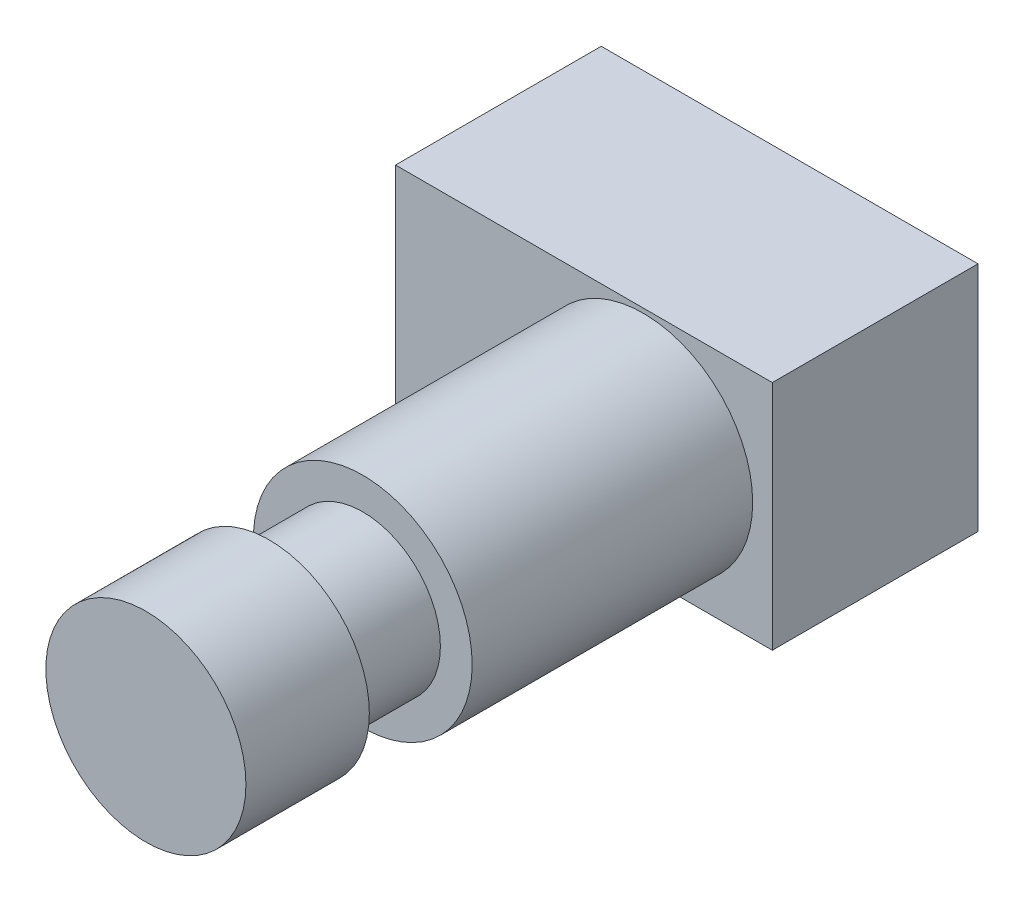
ISO-10303-21;
HEADER;
FILE_DESCRIPTION(('STEP AP214'),'2;1');
FILE_NAME('part.step','',(''),(''),'','','');
FILE_SCHEMA(('AUTOMOTIVE_DESIGN { 1 0 10303 214 1 1 1 1 }'));
ENDSEC;
DATA;
#1=APPLICATION_CONTEXT('core data for automotive mechanical design processes');
#2=APPLICATION_PROTOCOL_DEFINITION('international standard','automotive_design',2000,#1);
#3=PRODUCT_CONTEXT('',#1,'mechanical');
#4=PRODUCT('Part','Part','',(#3));
#5=PRODUCT_RELATED_PRODUCT_CATEGORY('part','',(#4));
#6=PRODUCT_DEFINITION_FORMATION('','',#4);
#7=PRODUCT_DEFINITION_CONTEXT('part definition',#1,'design');
#8=PRODUCT_DEFINITION('design','',#6,#7);
#9=PRODUCT_DEFINITION_SHAPE('','',#8);
#10=(LENGTH_UNIT() NAMED_UNIT(*) SI_UNIT(.MILLI.,.METRE.));
#11=(NAMED_UNIT(*) PLANE_ANGLE_UNIT() SI_UNIT($,.RADIAN.));
#12=(NAMED_UNIT(*) SI_UNIT($,.STERADIAN.) SOLID_ANGLE_UNIT());
#13=UNCERTAINTY_MEASURE_WITH_UNIT(LENGTH_MEASURE(1.E-05),#10,'distance_accuracy_value','');
#14=(GEOMETRIC_REPRESENTATION_CONTEXT(3) GLOBAL_UNCERTAINTY_ASSIGNED_CONTEXT((#13)) GLOBAL_UNIT_ASSIGNED_CONTEXT((#10,
#11,#12)) REPRESENTATION_CONTEXT('',''));
#15=CARTESIAN_POINT('',(0.,0.,0.));
#16=DIRECTION('',(0.,0.,1.));
#17=DIRECTION('',(1.,0.,0.));
#18=AXIS2_PLACEMENT_3D('',#15,#16,#17);
#19=CARTESIAN_POINT('',(0.,0.,15.));
#20=DIRECTION('',(0.,0.,-1.));
#21=DIRECTION('',(-1.,0.,0.));
#22=AXIS2_PLACEMENT_3D('',#19,#20,#21);
#23=CYLINDRICAL_SURFACE('',#22,5.85);
#24=CARTESIAN_POINT('',(0.,0.,15.));
#25=DIRECTION('',(0.,0.,1.));
#26=DIRECTION('',(1.,0.,0.));
#27=AXIS2_PLACEMENT_3D('',#24,#25,#26);
#28=CIRCLE('',#27,5.85);
#29=CARTESIAN_POINT('',(5.85,0.,15.));
#30=VERTEX_POINT('',#29);
#31=EDGE_CURVE('E49',#30,#30,#28,.T.);
#32=ORIENTED_EDGE('',*,*,#31,.F.);
#33=EDGE_LOOP('',(#32));
#34=FACE_BOUND('',#33,.T.);
#35=CARTESIAN_POINT('',(0.,0.,0.));
#36=DIRECTION('',(0.,0.,1.));
#37=DIRECTION('',(1.,0.,0.));
#38=AXIS2_PLACEMENT_3D('',#35,#36,#37);
#39=CIRCLE('',#38,5.85);
#40=CARTESIAN_POINT('',(5.85,0.,0.));
#41=VERTEX_POINT('',#40);
#42=EDGE_CURVE('E42',#41,#41,#39,.T.);
#43=ORIENTED_EDGE('',*,*,#42,.T.);
#44=EDGE_LOOP('',(#43));
#45=FACE_BOUND('',#44,.T.);
#46=ADVANCED_FACE('F39',(#34,#45),#23,.T.);
#47=CARTESIAN_POINT('',(0.,0.,15.));
#48=DIRECTION('',(0.,0.,1.));
#49=DIRECTION('',(1.,0.,0.));
#50=AXIS2_PLACEMENT_3D('',#47,#48,#49);
#51=PLANE('',#50);
#52=CARTESIAN_POINT('',(0.,0.,15.));
#53=DIRECTION('',(0.,0.,1.));
#54=DIRECTION('',(1.,0.,0.));
#55=AXIS2_PLACEMENT_3D('',#52,#53,#54);
#56=CIRCLE('',#55,4.15);
#57=CARTESIAN_POINT('',(4.15,0.,15.));
#58=VERTEX_POINT('',#57);
#59=EDGE_CURVE('E11',#58,#58,#56,.T.);
#60=ORIENTED_EDGE('',*,*,#59,.F.);
#61=EDGE_LOOP('',(#60));
#62=FACE_BOUND('',#61,.T.);
#63=ORIENTED_EDGE('',*,*,#31,.T.);
#64=EDGE_LOOP('',(#63));
#65=FACE_BOUND('',#64,.T.);
#66=ADVANCED_FACE('F144',(#62,#65),#51,.T.);
#67=CARTESIAN_POINT('',(0.,0.,20.));
#68=DIRECTION('',(0.,0.,-1.));
#69=DIRECTION('',(-1.,0.,0.));
#70=AXIS2_PLACEMENT_3D('',#67,#68,#69);
#71=CYLINDRICAL_SURFACE('',#70,4.15);
#72=CARTESIAN_POINT('',(0.,0.,20.));
#73=DIRECTION('',(0.,0.,1.));
#74=DIRECTION('',(1.,0.,0.));
#75=AXIS2_PLACEMENT_3D('',#72,#73,#74);
#76=CIRCLE('',#75,4.15);
#77=CARTESIAN_POINT('',(4.15,0.,20.));
#78=VERTEX_POINT('',#77);
#79=EDGE_CURVE('E133',#78,#78,#76,.T.);
#80=ORIENTED_EDGE('',*,*,#79,.F.);
#81=EDGE_LOOP('',(#80));
#82=FACE_BOUND('',#81,.T.);
#83=ORIENTED_EDGE('',*,*,#59,.T.);
#84=EDGE_LOOP('',(#83));
#85=FACE_BOUND('',#84,.T.);
#86=ADVANCED_FACE('F184',(#82,#85),#71,.T.);
#87=CARTESIAN_POINT('',(0.,0.,26.6));
#88=DIRECTION('',(0.,0.,-1.));
#89=DIRECTION('',(-1.,0.,0.));
#90=AXIS2_PLACEMENT_3D('',#87,#88,#89);
#91=CYLINDRICAL_SURFACE('',#90,5.35);
#92=CARTESIAN_POINT('',(0.,0.,26.6));
#93=DIRECTION('',(0.,0.,1.));
#94=DIRECTION('',(1.,0.,0.));
#95=AXIS2_PLACEMENT_3D('',#92,#93,#94);
#96=CIRCLE('',#95,5.35);
#97=CARTESIAN_POINT('',(5.35,0.,26.6));
#98=VERTEX_POINT('',#97);
#99=EDGE_CURVE('E129',#98,#98,#96,.T.);
#100=ORIENTED_EDGE('',*,*,#99,.F.);
#101=EDGE_LOOP('',(#100));
#102=FACE_BOUND('',#101,.T.);
#103=CARTESIAN_POINT('',(0.,0.,20.));
#104=DIRECTION('',(0.,0.,1.));
#105=DIRECTION('',(1.,0.,0.));
#106=AXIS2_PLACEMENT_3D('',#103,#104,#105);
#107=CIRCLE('',#106,5.35);
#108=CARTESIAN_POINT('',(5.35,0.,20.));
#109=VERTEX_POINT('',#108);
#110=EDGE_CURVE('E134',#109,#109,#107,.T.);
#111=ORIENTED_EDGE('',*,*,#110,.T.);
#112=EDGE_LOOP('',(#111));
#113=FACE_BOUND('',#112,.T.);
#114=ADVANCED_FACE('F177',(#102,#113),#91,.T.);
#115=CARTESIAN_POINT('',(0.,0.,26.6));
#116=DIRECTION('',(0.,0.,1.));
#117=DIRECTION('',(1.,0.,0.));
#118=AXIS2_PLACEMENT_3D('',#115,#116,#117);
#119=PLANE('',#118);
#120=ORIENTED_EDGE('',*,*,#99,.T.);
#121=EDGE_LOOP('',(#120));
#122=FACE_BOUND('',#121,.T.);
#123=ADVANCED_FACE('F174',(#122),#119,.T.);
#124=CARTESIAN_POINT('',(0.,0.,20.));
#125=DIRECTION('',(0.,0.,1.));
#126=DIRECTION('',(1.,0.,0.));
#127=AXIS2_PLACEMENT_3D('',#124,#125,#126);
#128=PLANE('',#127);
#129=ORIENTED_EDGE('',*,*,#79,.T.);
#130=EDGE_LOOP('',(#129));
#131=FACE_BOUND('',#130,.T.);
#132=ORIENTED_EDGE('',*,*,#110,.F.);
#133=EDGE_LOOP('',(#132));
#134=FACE_BOUND('',#133,.T.);
#135=ADVANCED_FACE('F173',(#131,#134),#128,.F.);
#136=CARTESIAN_POINT('',(6.9,-6.31313605271234,-11.));
#137=DIRECTION('',(-1.,0.,0.));
#138=DIRECTION('',(0.,0.,1.));
#139=AXIS2_PLACEMENT_3D('',#136,#137,#138);
#140=PLANE('',#139);
#141=DIRECTION('',(0.,-1.,0.));
#142=VECTOR('',#141,1.);
#143=CARTESIAN_POINT('',(6.9,-6.31313605271234,0.));
#144=LINE('',#143,#142);
#145=CARTESIAN_POINT('',(6.9,6.08686394728766,0.));
#146=VERTEX_POINT('',#145);
#147=CARTESIAN_POINT('',(6.9,-6.31313605271234,0.));
#148=VERTEX_POINT('',#147);
#149=EDGE_CURVE('E113',#146,#148,#144,.T.);
#150=ORIENTED_EDGE('',*,*,#149,.T.);
#151=DIRECTION('',(0.,0.,1.));
#152=VECTOR('',#151,1.);
#153=CARTESIAN_POINT('',(6.9,-6.31313605271234,-11.));
#154=LINE('',#153,#152);
#155=CARTESIAN_POINT('',(6.9,-6.31313605271234,-11.));
#156=VERTEX_POINT('',#155);
#157=EDGE_CURVE('E102',#156,#148,#154,.T.);
#158=ORIENTED_EDGE('',*,*,#157,.F.);
#159=DIRECTION('',(0.,-1.,0.));
#160=VECTOR('',#159,1.);
#161=CARTESIAN_POINT('',(6.9,-6.31313605271234,-11.));
#162=LINE('',#161,#160);
#163=CARTESIAN_POINT('',(6.9,6.08686394728766,-11.));
#164=VERTEX_POINT('',#163);
#165=EDGE_CURVE('E94',#164,#156,#162,.T.);
#166=ORIENTED_EDGE('',*,*,#165,.F.);
#167=DIRECTION('',(0.,0.,1.));
#168=VECTOR('',#167,1.);
#169=CARTESIAN_POINT('',(6.9,6.08686394728766,-11.));
#170=LINE('',#169,#168);
#171=EDGE_CURVE('E109',#164,#146,#170,.T.);
#172=ORIENTED_EDGE('',*,*,#171,.T.);
#173=EDGE_LOOP('',(#150,#158,#166,#172));
#174=FACE_BOUND('',#173,.T.);
#175=ADVANCED_FACE('F158',(#174),#140,.F.);
#176=CARTESIAN_POINT('',(-13.25,-6.31313605271234,-11.));
#177=DIRECTION('',(0.,1.,0.));
#178=DIRECTION('',(-1.,0.,0.));
#179=AXIS2_PLACEMENT_3D('',#176,#177,#178);
#180=PLANE('',#179);
#181=DIRECTION('',(-1.,0.,0.));
#182=VECTOR('',#181,1.);
#183=CARTESIAN_POINT('',(-13.25,-6.31313605271234,0.));
#184=LINE('',#183,#182);
#185=CARTESIAN_POINT('',(-13.25,-6.31313605271234,0.));
#186=VERTEX_POINT('',#185);
#187=EDGE_CURVE('E100',#148,#186,#184,.T.);
#188=ORIENTED_EDGE('',*,*,#187,.T.);
#189=DIRECTION('',(0.,0.,1.));
#190=VECTOR('',#189,1.);
#191=CARTESIAN_POINT('',(-13.25,-6.31313605271234,-11.));
#192=LINE('',#191,#190);
#193=CARTESIAN_POINT('',(-13.25,-6.31313605271234,-11.));
#194=VERTEX_POINT('',#193);
#195=EDGE_CURVE('E98',#194,#186,#192,.T.);
#196=ORIENTED_EDGE('',*,*,#195,.F.);
#197=DIRECTION('',(-1.,0.,0.));
#198=VECTOR('',#197,1.);
#199=CARTESIAN_POINT('',(-13.25,-6.31313605271234,-11.));
#200=LINE('',#199,#198);
#201=EDGE_CURVE('E89',#156,#194,#200,.T.);
#202=ORIENTED_EDGE('',*,*,#201,.F.);
#203=ORIENTED_EDGE('',*,*,#157,.T.);
#204=EDGE_LOOP('',(#188,#196,#202,#203));
#205=FACE_BOUND('',#204,.T.);
#206=ADVANCED_FACE('F99',(#205),#180,.F.);
#207=CARTESIAN_POINT('',(-13.25,-6.31313605271234,-11.));
#208=DIRECTION('',(1.,0.,0.));
#209=DIRECTION('',(0.,0.,-1.));
#210=AXIS2_PLACEMENT_3D('',#207,#208,#209);
#211=PLANE('',#210);
#212=DIRECTION('',(0.,1.,0.));
#213=VECTOR('',#212,1.);
#214=CARTESIAN_POINT('',(-13.25,-6.31313605271234,0.));
#215=LINE('',#214,#213);
#216=CARTESIAN_POINT('',(-13.25,6.08686394728766,0.));
#217=VERTEX_POINT('',#216);
#218=EDGE_CURVE('E75',#186,#217,#215,.T.);
#219=ORIENTED_EDGE('',*,*,#218,.T.);
#220=DIRECTION('',(0.,0.,1.));
#221=VECTOR('',#220,1.);
#222=CARTESIAN_POINT('',(-13.25,6.08686394728766,-11.));
#223=LINE('',#222,#221);
#224=CARTESIAN_POINT('',(-13.25,6.08686394728766,-11.));
#225=VERTEX_POINT('',#224);
#226=EDGE_CURVE('E103',#225,#217,#223,.T.);
#227=ORIENTED_EDGE('',*,*,#226,.F.);
#228=DIRECTION('',(0.,1.,0.));
#229=VECTOR('',#228,1.);
#230=CARTESIAN_POINT('',(-13.25,-6.31313605271234,-11.));
#231=LINE('',#230,#229);
#232=EDGE_CURVE('E92',#194,#225,#231,.T.);
#233=ORIENTED_EDGE('',*,*,#232,.F.);
#234=ORIENTED_EDGE('',*,*,#195,.T.);
#235=EDGE_LOOP('',(#219,#227,#233,#234));
#236=FACE_BOUND('',#235,.T.);
#237=ADVANCED_FACE('F105',(#236),#211,.F.);
#238=CARTESIAN_POINT('',(-13.25,6.08686394728766,-11.));
#239=DIRECTION('',(0.,-1.,0.));
#240=DIRECTION('',(1.,0.,0.));
#241=AXIS2_PLACEMENT_3D('',#238,#239,#240);
#242=PLANE('',#241);
#243=DIRECTION('',(1.,0.,0.));
#244=VECTOR('',#243,1.);
#245=CARTESIAN_POINT('',(-13.25,6.08686394728766,0.));
#246=LINE('',#245,#244);
#247=EDGE_CURVE('E81',#217,#146,#246,.T.);
#248=ORIENTED_EDGE('',*,*,#247,.T.);
#249=ORIENTED_EDGE('',*,*,#171,.F.);
#250=DIRECTION('',(1.,0.,0.));
#251=VECTOR('',#250,1.);
#252=CARTESIAN_POINT('',(-13.25,6.08686394728766,-11.));
#253=LINE('',#252,#251);
#254=EDGE_CURVE('E58',#225,#164,#253,.T.);
#255=ORIENTED_EDGE('',*,*,#254,.F.);
#256=ORIENTED_EDGE('',*,*,#226,.T.);
#257=EDGE_LOOP('',(#248,#249,#255,#256));
#258=FACE_BOUND('',#257,.T.);
#259=ADVANCED_FACE('F159',(#258),#242,.F.);
#260=CARTESIAN_POINT('',(0.,0.,-11.));
#261=DIRECTION('',(0.,0.,-1.));
#262=DIRECTION('',(-1.,0.,0.));
#263=AXIS2_PLACEMENT_3D('',#260,#261,#262);
#264=PLANE('',#263);
#265=ORIENTED_EDGE('',*,*,#165,.T.);
#266=ORIENTED_EDGE('',*,*,#201,.T.);
#267=ORIENTED_EDGE('',*,*,#232,.T.);
#268=ORIENTED_EDGE('',*,*,#254,.T.);
#269=EDGE_LOOP('',(#265,#266,#267,#268));
#270=FACE_BOUND('',#269,.T.);
#271=ADVANCED_FACE('F90',(#270),#264,.T.);
#272=CARTESIAN_POINT('',(0.,0.,0.));
#273=DIRECTION('',(0.,0.,-1.));
#274=DIRECTION('',(-1.,0.,0.));
#275=AXIS2_PLACEMENT_3D('',#272,#273,#274);
#276=PLANE('',#275);
#277=ORIENTED_EDGE('',*,*,#42,.F.);
#278=EDGE_LOOP('',(#277));
#279=FACE_BOUND('',#278,.T.);
#280=ORIENTED_EDGE('',*,*,#149,.F.);
#281=ORIENTED_EDGE('',*,*,#247,.F.);
#282=ORIENTED_EDGE('',*,*,#218,.F.);
#283=ORIENTED_EDGE('',*,*,#187,.F.);
#284=EDGE_LOOP('',(#280,#281,#282,#283));
#285=FACE_BOUND('',#284,.T.);
#286=ADVANCED_FACE('F152',(#279,#285),#276,.F.);
#287=CLOSED_SHELL('',(#46,#66,#86,#114,#123,#135,#175,#206,#237,#259,#271,#286));
#288=MANIFOLD_SOLID_BREP('B2',#287);
#289=ADVANCED_BREP_SHAPE_REPRESENTATION('',(#18,#288),#14);
#290=SHAPE_DEFINITION_REPRESENTATION(#9,#289);
ENDSEC;
END-ISO-10303-21;
